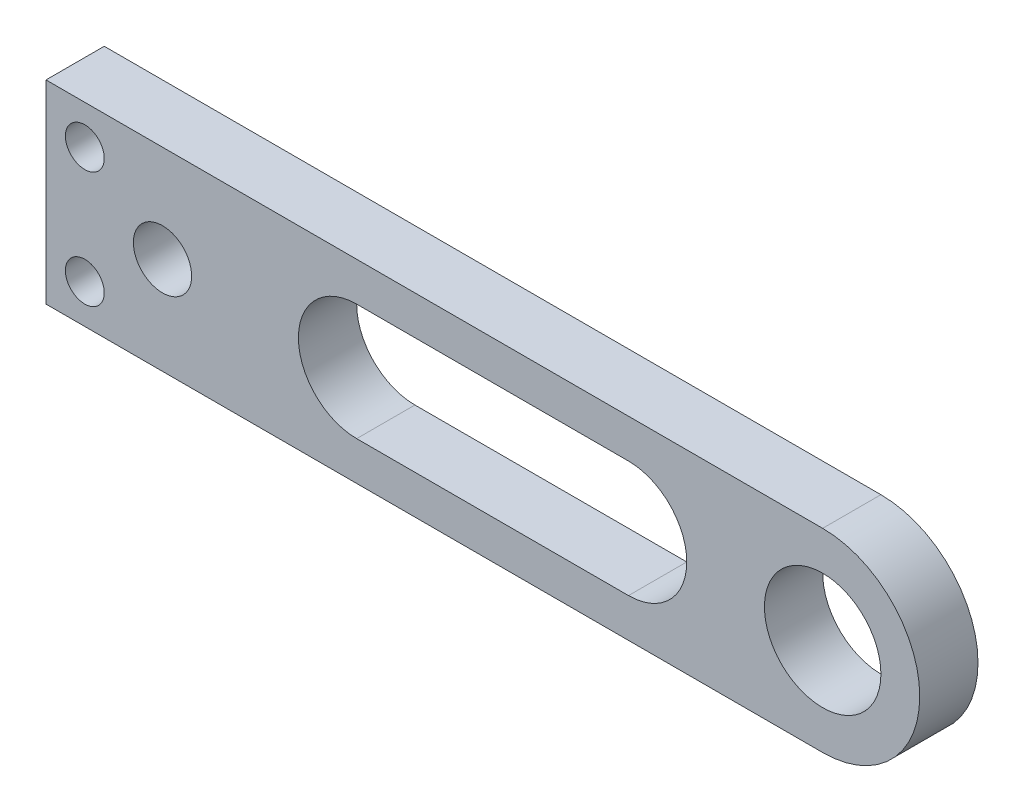
ISO-10303-21;
HEADER;
FILE_DESCRIPTION(('STEP AP214'),'2;1');
FILE_NAME('part.step','',(''),(''),'','','');
FILE_SCHEMA(('AUTOMOTIVE_DESIGN { 1 0 10303 214 1 1 1 1 }'));
ENDSEC;
DATA;
#1=APPLICATION_CONTEXT('core data for automotive mechanical design processes');
#2=APPLICATION_PROTOCOL_DEFINITION('international standard','automotive_design',2000,#1);
#3=PRODUCT_CONTEXT('',#1,'mechanical');
#4=PRODUCT('Part','Part','',(#3));
#5=PRODUCT_RELATED_PRODUCT_CATEGORY('part','',(#4));
#6=PRODUCT_DEFINITION_FORMATION('','',#4);
#7=PRODUCT_DEFINITION_CONTEXT('part definition',#1,'design');
#8=PRODUCT_DEFINITION('design','',#6,#7);
#9=PRODUCT_DEFINITION_SHAPE('','',#8);
#10=(LENGTH_UNIT() NAMED_UNIT(*) SI_UNIT(.MILLI.,.METRE.));
#11=(NAMED_UNIT(*) PLANE_ANGLE_UNIT() SI_UNIT($,.RADIAN.));
#12=(NAMED_UNIT(*) SI_UNIT($,.STERADIAN.) SOLID_ANGLE_UNIT());
#13=UNCERTAINTY_MEASURE_WITH_UNIT(LENGTH_MEASURE(1.E-05),#10,'distance_accuracy_value','');
#14=(GEOMETRIC_REPRESENTATION_CONTEXT(3) GLOBAL_UNCERTAINTY_ASSIGNED_CONTEXT((#13)) GLOBAL_UNIT_ASSIGNED_CONTEXT((#10,
#11,#12)) REPRESENTATION_CONTEXT('',''));
#15=CARTESIAN_POINT('',(0.,0.,0.));
#16=DIRECTION('',(0.,0.,1.));
#17=DIRECTION('',(1.,0.,0.));
#18=AXIS2_PLACEMENT_3D('',#15,#16,#17);
#19=CARTESIAN_POINT('',(34.,0.,3.));
#20=DIRECTION('',(0.,0.,1.));
#21=DIRECTION('',(1.,0.,0.));
#22=AXIS2_PLACEMENT_3D('',#19,#20,#21);
#23=PLANE('',#22);
#24=CARTESIAN_POINT('',(-4.,3.,3.));
#25=DIRECTION('',(0.,0.,1.));
#26=DIRECTION('',(1.,0.,0.));
#27=AXIS2_PLACEMENT_3D('',#24,#25,#26);
#28=CIRCLE('',#27,1.);
#29=CARTESIAN_POINT('',(-3.,3.,3.));
#30=VERTEX_POINT('',#29);
#31=EDGE_CURVE('E128',#30,#30,#28,.T.);
#32=ORIENTED_EDGE('',*,*,#31,.F.);
#33=EDGE_LOOP('',(#32));
#34=FACE_BOUND('',#33,.T.);
#35=CARTESIAN_POINT('',(0.,0.,3.));
#36=DIRECTION('',(0.,0.,1.));
#37=DIRECTION('',(1.,0.,0.));
#38=AXIS2_PLACEMENT_3D('',#35,#36,#37);
#39=CIRCLE('',#38,1.5);
#40=CARTESIAN_POINT('',(1.5,0.,3.));
#41=VERTEX_POINT('',#40);
#42=EDGE_CURVE('E144',#41,#41,#39,.T.);
#43=ORIENTED_EDGE('',*,*,#42,.F.);
#44=EDGE_LOOP('',(#43));
#45=FACE_BOUND('',#44,.T.);
#46=DIRECTION('',(-1.,0.,0.));
#47=VECTOR('',#46,1.);
#48=CARTESIAN_POINT('',(0.,5.,3.));
#49=LINE('',#48,#47);
#50=CARTESIAN_POINT('',(34.,5.,3.));
#51=VERTEX_POINT('',#50);
#52=CARTESIAN_POINT('',(-6.,5.,3.));
#53=VERTEX_POINT('',#52);
#54=EDGE_CURVE('E150',#51,#53,#49,.T.);
#55=ORIENTED_EDGE('',*,*,#54,.T.);
#56=DIRECTION('',(0.,-1.,0.));
#57=VECTOR('',#56,1.);
#58=CARTESIAN_POINT('',(-6.,5.,3.));
#59=LINE('',#58,#57);
#60=CARTESIAN_POINT('',(-6.,-5.,3.));
#61=VERTEX_POINT('',#60);
#62=EDGE_CURVE('E153',#53,#61,#59,.T.);
#63=ORIENTED_EDGE('',*,*,#62,.T.);
#64=DIRECTION('',(1.,0.,0.));
#65=VECTOR('',#64,1.);
#66=CARTESIAN_POINT('',(-6.,-5.,3.));
#67=LINE('',#66,#65);
#68=CARTESIAN_POINT('',(34.,-5.,3.));
#69=VERTEX_POINT('',#68);
#70=EDGE_CURVE('E156',#61,#69,#67,.T.);
#71=ORIENTED_EDGE('',*,*,#70,.T.);
#72=CARTESIAN_POINT('',(34.,0.,3.));
#73=DIRECTION('',(0.,0.,1.));
#74=DIRECTION('',(1.,0.,0.));
#75=AXIS2_PLACEMENT_3D('',#72,#73,#74);
#76=CIRCLE('',#75,5.);
#77=EDGE_CURVE('E158',#69,#51,#76,.T.);
#78=ORIENTED_EDGE('',*,*,#77,.T.);
#79=EDGE_LOOP('',(#55,#63,#71,#78));
#80=FACE_BOUND('',#79,.T.);
#81=CARTESIAN_POINT('',(34.,0.,3.));
#82=DIRECTION('',(0.,0.,1.));
#83=DIRECTION('',(1.,0.,0.));
#84=AXIS2_PLACEMENT_3D('',#81,#82,#83);
#85=CIRCLE('',#84,2.99999999999999);
#86=CARTESIAN_POINT('',(37.,0.,3.));
#87=VERTEX_POINT('',#86);
#88=EDGE_CURVE('E138',#87,#87,#85,.T.);
#89=ORIENTED_EDGE('',*,*,#88,.F.);
#90=EDGE_LOOP('',(#89));
#91=FACE_BOUND('',#90,.T.);
#92=DIRECTION('',(1.,0.,0.));
#93=VECTOR('',#92,1.);
#94=CARTESIAN_POINT('',(10.,-3.,3.));
#95=LINE('',#94,#93);
#96=CARTESIAN_POINT('',(10.,-3.,3.));
#97=VERTEX_POINT('',#96);
#98=CARTESIAN_POINT('',(24.,-3.,3.));
#99=VERTEX_POINT('',#98);
#100=EDGE_CURVE('E107',#97,#99,#95,.T.);
#101=ORIENTED_EDGE('',*,*,#100,.F.);
#102=CARTESIAN_POINT('',(10.,0.,3.));
#103=DIRECTION('',(0.,0.,1.));
#104=DIRECTION('',(1.,0.,0.));
#105=AXIS2_PLACEMENT_3D('',#102,#103,#104);
#106=CIRCLE('',#105,3.);
#107=CARTESIAN_POINT('',(10.,3.,3.));
#108=VERTEX_POINT('',#107);
#109=EDGE_CURVE('E99',#108,#97,#106,.T.);
#110=ORIENTED_EDGE('',*,*,#109,.F.);
#111=DIRECTION('',(-1.,0.,0.));
#112=VECTOR('',#111,1.);
#113=CARTESIAN_POINT('',(10.,3.,3.));
#114=LINE('',#113,#112);
#115=CARTESIAN_POINT('',(24.,3.,3.));
#116=VERTEX_POINT('',#115);
#117=EDGE_CURVE('E122',#116,#108,#114,.T.);
#118=ORIENTED_EDGE('',*,*,#117,.F.);
#119=CARTESIAN_POINT('',(24.,0.,3.));
#120=DIRECTION('',(0.,0.,1.));
#121=DIRECTION('',(1.,0.,0.));
#122=AXIS2_PLACEMENT_3D('',#119,#120,#121);
#123=CIRCLE('',#122,3.);
#124=EDGE_CURVE('E120',#99,#116,#123,.T.);
#125=ORIENTED_EDGE('',*,*,#124,.F.);
#126=EDGE_LOOP('',(#101,#110,#118,#125));
#127=FACE_BOUND('',#126,.T.);
#128=CARTESIAN_POINT('',(-4.,-3.,3.));
#129=DIRECTION('',(0.,0.,1.));
#130=DIRECTION('',(1.,0.,0.));
#131=AXIS2_PLACEMENT_3D('',#128,#129,#130);
#132=CIRCLE('',#131,1.);
#133=CARTESIAN_POINT('',(-3.,-3.,3.));
#134=VERTEX_POINT('',#133);
#135=EDGE_CURVE('E331',#134,#134,#132,.T.);
#136=ORIENTED_EDGE('',*,*,#135,.F.);
#137=EDGE_LOOP('',(#136));
#138=FACE_BOUND('',#137,.T.);
#139=ADVANCED_FACE('F34',(#34,#45,#80,#91,#127,#138),#23,.T.);
#140=CARTESIAN_POINT('',(34.,0.,0.));
#141=DIRECTION('',(0.,0.,1.));
#142=DIRECTION('',(1.,0.,0.));
#143=AXIS2_PLACEMENT_3D('',#140,#141,#142);
#144=PLANE('',#143);
#145=CARTESIAN_POINT('',(34.,0.,0.));
#146=DIRECTION('',(0.,0.,1.));
#147=DIRECTION('',(1.,0.,0.));
#148=AXIS2_PLACEMENT_3D('',#145,#146,#147);
#149=CIRCLE('',#148,2.99999999999999);
#150=CARTESIAN_POINT('',(37.,0.,0.));
#151=VERTEX_POINT('',#150);
#152=EDGE_CURVE('E115',#151,#151,#149,.T.);
#153=ORIENTED_EDGE('',*,*,#152,.T.);
#154=EDGE_LOOP('',(#153));
#155=FACE_BOUND('',#154,.T.);
#156=CARTESIAN_POINT('',(0.,0.,0.));
#157=DIRECTION('',(0.,0.,1.));
#158=DIRECTION('',(1.,0.,0.));
#159=AXIS2_PLACEMENT_3D('',#156,#157,#158);
#160=CIRCLE('',#159,1.5);
#161=CARTESIAN_POINT('',(1.5,0.,0.));
#162=VERTEX_POINT('',#161);
#163=EDGE_CURVE('E141',#162,#162,#160,.T.);
#164=ORIENTED_EDGE('',*,*,#163,.T.);
#165=EDGE_LOOP('',(#164));
#166=FACE_BOUND('',#165,.T.);
#167=DIRECTION('',(0.,-1.,0.));
#168=VECTOR('',#167,1.);
#169=CARTESIAN_POINT('',(-6.,5.,0.));
#170=LINE('',#169,#168);
#171=CARTESIAN_POINT('',(-6.,5.,0.));
#172=VERTEX_POINT('',#171);
#173=CARTESIAN_POINT('',(-6.,-5.,0.));
#174=VERTEX_POINT('',#173);
#175=EDGE_CURVE('E147',#172,#174,#170,.T.);
#176=ORIENTED_EDGE('',*,*,#175,.F.);
#177=DIRECTION('',(-1.,0.,0.));
#178=VECTOR('',#177,1.);
#179=CARTESIAN_POINT('',(0.,5.,0.));
#180=LINE('',#179,#178);
#181=CARTESIAN_POINT('',(34.,5.,0.));
#182=VERTEX_POINT('',#181);
#183=EDGE_CURVE('E154',#182,#172,#180,.T.);
#184=ORIENTED_EDGE('',*,*,#183,.F.);
#185=CARTESIAN_POINT('',(34.,0.,0.));
#186=DIRECTION('',(0.,0.,1.));
#187=DIRECTION('',(1.,0.,0.));
#188=AXIS2_PLACEMENT_3D('',#185,#186,#187);
#189=CIRCLE('',#188,5.);
#190=CARTESIAN_POINT('',(34.,-5.,0.));
#191=VERTEX_POINT('',#190);
#192=EDGE_CURVE('E166',#191,#182,#189,.T.);
#193=ORIENTED_EDGE('',*,*,#192,.F.);
#194=DIRECTION('',(1.,0.,0.));
#195=VECTOR('',#194,1.);
#196=CARTESIAN_POINT('',(0.,-5.,0.));
#197=LINE('',#196,#195);
#198=EDGE_CURVE('E164',#174,#191,#197,.T.);
#199=ORIENTED_EDGE('',*,*,#198,.F.);
#200=EDGE_LOOP('',(#176,#184,#193,#199));
#201=FACE_BOUND('',#200,.T.);
#202=CARTESIAN_POINT('',(10.,0.,0.));
#203=DIRECTION('',(0.,0.,1.));
#204=DIRECTION('',(1.,0.,0.));
#205=AXIS2_PLACEMENT_3D('',#202,#203,#204);
#206=CIRCLE('',#205,3.);
#207=CARTESIAN_POINT('',(10.,3.,0.));
#208=VERTEX_POINT('',#207);
#209=CARTESIAN_POINT('',(10.,-3.,0.));
#210=VERTEX_POINT('',#209);
#211=EDGE_CURVE('E57',#208,#210,#206,.T.);
#212=ORIENTED_EDGE('',*,*,#211,.T.);
#213=DIRECTION('',(1.,0.,0.));
#214=VECTOR('',#213,1.);
#215=CARTESIAN_POINT('',(10.,-3.,0.));
#216=LINE('',#215,#214);
#217=CARTESIAN_POINT('',(24.,-3.,0.));
#218=VERTEX_POINT('',#217);
#219=EDGE_CURVE('E114',#210,#218,#216,.T.);
#220=ORIENTED_EDGE('',*,*,#219,.T.);
#221=CARTESIAN_POINT('',(24.,0.,0.));
#222=DIRECTION('',(0.,0.,1.));
#223=DIRECTION('',(1.,0.,0.));
#224=AXIS2_PLACEMENT_3D('',#221,#222,#223);
#225=CIRCLE('',#224,3.);
#226=CARTESIAN_POINT('',(24.,3.,0.));
#227=VERTEX_POINT('',#226);
#228=EDGE_CURVE('E130',#218,#227,#225,.T.);
#229=ORIENTED_EDGE('',*,*,#228,.T.);
#230=DIRECTION('',(-1.,0.,0.));
#231=VECTOR('',#230,1.);
#232=CARTESIAN_POINT('',(10.,3.,0.));
#233=LINE('',#232,#231);
#234=EDGE_CURVE('E108',#227,#208,#233,.T.);
#235=ORIENTED_EDGE('',*,*,#234,.T.);
#236=EDGE_LOOP('',(#212,#220,#229,#235));
#237=FACE_BOUND('',#236,.T.);
#238=CARTESIAN_POINT('',(-4.,3.,0.));
#239=DIRECTION('',(0.,0.,1.));
#240=DIRECTION('',(1.,0.,0.));
#241=AXIS2_PLACEMENT_3D('',#238,#239,#240);
#242=CIRCLE('',#241,1.);
#243=CARTESIAN_POINT('',(-3.,3.,0.));
#244=VERTEX_POINT('',#243);
#245=EDGE_CURVE('E337',#244,#244,#242,.T.);
#246=ORIENTED_EDGE('',*,*,#245,.T.);
#247=EDGE_LOOP('',(#246));
#248=FACE_BOUND('',#247,.T.);
#249=CARTESIAN_POINT('',(-4.,-3.,0.));
#250=DIRECTION('',(0.,0.,1.));
#251=DIRECTION('',(1.,0.,0.));
#252=AXIS2_PLACEMENT_3D('',#249,#250,#251);
#253=CIRCLE('',#252,1.);
#254=CARTESIAN_POINT('',(-3.,-3.,0.));
#255=VERTEX_POINT('',#254);
#256=EDGE_CURVE('E334',#255,#255,#253,.T.);
#257=ORIENTED_EDGE('',*,*,#256,.T.);
#258=EDGE_LOOP('',(#257));
#259=FACE_BOUND('',#258,.T.);
#260=ADVANCED_FACE('F184',(#155,#166,#201,#237,#248,#259),#144,.F.);
#261=CARTESIAN_POINT('',(-6.,5.,3.));
#262=DIRECTION('',(1.,0.,0.));
#263=DIRECTION('',(0.,1.,0.));
#264=AXIS2_PLACEMENT_3D('',#261,#262,#263);
#265=PLANE('',#264);
#266=ORIENTED_EDGE('',*,*,#175,.T.);
#267=DIRECTION('',(0.,0.,-1.));
#268=VECTOR('',#267,1.);
#269=CARTESIAN_POINT('',(-6.,-5.,3.));
#270=LINE('',#269,#268);
#271=EDGE_CURVE('E42',#61,#174,#270,.T.);
#272=ORIENTED_EDGE('',*,*,#271,.F.);
#273=ORIENTED_EDGE('',*,*,#62,.F.);
#274=DIRECTION('',(0.,0.,-1.));
#275=VECTOR('',#274,1.);
#276=CARTESIAN_POINT('',(-6.,5.,3.));
#277=LINE('',#276,#275);
#278=EDGE_CURVE('E11',#53,#172,#277,.T.);
#279=ORIENTED_EDGE('',*,*,#278,.T.);
#280=EDGE_LOOP('',(#266,#272,#273,#279));
#281=FACE_BOUND('',#280,.T.);
#282=ADVANCED_FACE('F36',(#281),#265,.F.);
#283=CARTESIAN_POINT('',(0.,-5.,3.));
#284=DIRECTION('',(0.,1.,0.));
#285=DIRECTION('',(0.,0.,1.));
#286=AXIS2_PLACEMENT_3D('',#283,#284,#285);
#287=PLANE('',#286);
#288=ORIENTED_EDGE('',*,*,#198,.T.);
#289=DIRECTION('',(0.,0.,-1.));
#290=VECTOR('',#289,1.);
#291=CARTESIAN_POINT('',(34.,-5.,3.));
#292=LINE('',#291,#290);
#293=EDGE_CURVE('E171',#69,#191,#292,.T.);
#294=ORIENTED_EDGE('',*,*,#293,.F.);
#295=ORIENTED_EDGE('',*,*,#70,.F.);
#296=ORIENTED_EDGE('',*,*,#271,.T.);
#297=EDGE_LOOP('',(#288,#294,#295,#296));
#298=FACE_BOUND('',#297,.T.);
#299=ADVANCED_FACE('F177',(#298),#287,.F.);
#300=CARTESIAN_POINT('',(34.,0.,3.));
#301=DIRECTION('',(0.,0.,-1.));
#302=DIRECTION('',(-1.,0.,0.));
#303=AXIS2_PLACEMENT_3D('',#300,#301,#302);
#304=CYLINDRICAL_SURFACE('',#303,5.);
#305=ORIENTED_EDGE('',*,*,#192,.T.);
#306=DIRECTION('',(0.,0.,-1.));
#307=VECTOR('',#306,1.);
#308=CARTESIAN_POINT('',(34.,5.,3.));
#309=LINE('',#308,#307);
#310=EDGE_CURVE('E161',#51,#182,#309,.T.);
#311=ORIENTED_EDGE('',*,*,#310,.F.);
#312=ORIENTED_EDGE('',*,*,#77,.F.);
#313=ORIENTED_EDGE('',*,*,#293,.T.);
#314=EDGE_LOOP('',(#305,#311,#312,#313));
#315=FACE_BOUND('',#314,.T.);
#316=ADVANCED_FACE('F189',(#315),#304,.T.);
#317=CARTESIAN_POINT('',(0.,5.,3.));
#318=DIRECTION('',(0.,-1.,0.));
#319=DIRECTION('',(0.,0.,-1.));
#320=AXIS2_PLACEMENT_3D('',#317,#318,#319);
#321=PLANE('',#320);
#322=ORIENTED_EDGE('',*,*,#183,.T.);
#323=ORIENTED_EDGE('',*,*,#278,.F.);
#324=ORIENTED_EDGE('',*,*,#54,.F.);
#325=ORIENTED_EDGE('',*,*,#310,.T.);
#326=EDGE_LOOP('',(#322,#323,#324,#325));
#327=FACE_BOUND('',#326,.T.);
#328=ADVANCED_FACE('F192',(#327),#321,.F.);
#329=CARTESIAN_POINT('',(0.,0.,3.));
#330=DIRECTION('',(0.,0.,-1.));
#331=DIRECTION('',(-1.,0.,0.));
#332=AXIS2_PLACEMENT_3D('',#329,#330,#331);
#333=CYLINDRICAL_SURFACE('',#332,1.5);
#334=ORIENTED_EDGE('',*,*,#42,.T.);
#335=EDGE_LOOP('',(#334));
#336=FACE_BOUND('',#335,.T.);
#337=ORIENTED_EDGE('',*,*,#163,.F.);
#338=EDGE_LOOP('',(#337));
#339=FACE_BOUND('',#338,.T.);
#340=ADVANCED_FACE('F203',(#336,#339),#333,.F.);
#341=CARTESIAN_POINT('',(34.,0.,3.));
#342=DIRECTION('',(0.,0.,-1.));
#343=DIRECTION('',(-1.,0.,0.));
#344=AXIS2_PLACEMENT_3D('',#341,#342,#343);
#345=CYLINDRICAL_SURFACE('',#344,2.99999999999999);
#346=ORIENTED_EDGE('',*,*,#88,.T.);
#347=EDGE_LOOP('',(#346));
#348=FACE_BOUND('',#347,.T.);
#349=ORIENTED_EDGE('',*,*,#152,.F.);
#350=EDGE_LOOP('',(#349));
#351=FACE_BOUND('',#350,.T.);
#352=ADVANCED_FACE('F200',(#348,#351),#345,.F.);
#353=CARTESIAN_POINT('',(10.,0.,3.));
#354=DIRECTION('',(0.,0.,-1.));
#355=DIRECTION('',(-1.,0.,0.));
#356=AXIS2_PLACEMENT_3D('',#353,#354,#355);
#357=CYLINDRICAL_SURFACE('',#356,3.);
#358=ORIENTED_EDGE('',*,*,#211,.F.);
#359=DIRECTION('',(0.,0.,-1.));
#360=VECTOR('',#359,1.);
#361=CARTESIAN_POINT('',(10.,3.,3.));
#362=LINE('',#361,#360);
#363=EDGE_CURVE('E103',#108,#208,#362,.T.);
#364=ORIENTED_EDGE('',*,*,#363,.F.);
#365=ORIENTED_EDGE('',*,*,#109,.T.);
#366=DIRECTION('',(0.,0.,-1.));
#367=VECTOR('',#366,1.);
#368=CARTESIAN_POINT('',(10.,-3.,3.));
#369=LINE('',#368,#367);
#370=EDGE_CURVE('E102',#97,#210,#369,.T.);
#371=ORIENTED_EDGE('',*,*,#370,.T.);
#372=EDGE_LOOP('',(#358,#364,#365,#371));
#373=FACE_BOUND('',#372,.T.);
#374=ADVANCED_FACE('F101',(#373),#357,.F.);
#375=CARTESIAN_POINT('',(10.,-3.,3.));
#376=DIRECTION('',(0.,1.,0.));
#377=DIRECTION('',(-1.,0.,0.));
#378=AXIS2_PLACEMENT_3D('',#375,#376,#377);
#379=PLANE('',#378);
#380=ORIENTED_EDGE('',*,*,#219,.F.);
#381=ORIENTED_EDGE('',*,*,#370,.F.);
#382=ORIENTED_EDGE('',*,*,#100,.T.);
#383=DIRECTION('',(0.,0.,-1.));
#384=VECTOR('',#383,1.);
#385=CARTESIAN_POINT('',(24.,-3.,3.));
#386=LINE('',#385,#384);
#387=EDGE_CURVE('E116',#99,#218,#386,.T.);
#388=ORIENTED_EDGE('',*,*,#387,.T.);
#389=EDGE_LOOP('',(#380,#381,#382,#388));
#390=FACE_BOUND('',#389,.T.);
#391=ADVANCED_FACE('F111',(#390),#379,.T.);
#392=CARTESIAN_POINT('',(24.,0.,3.));
#393=DIRECTION('',(0.,0.,-1.));
#394=DIRECTION('',(-1.,0.,0.));
#395=AXIS2_PLACEMENT_3D('',#392,#393,#394);
#396=CYLINDRICAL_SURFACE('',#395,3.);
#397=ORIENTED_EDGE('',*,*,#228,.F.);
#398=ORIENTED_EDGE('',*,*,#387,.F.);
#399=ORIENTED_EDGE('',*,*,#124,.T.);
#400=DIRECTION('',(0.,0.,-1.));
#401=VECTOR('',#400,1.);
#402=CARTESIAN_POINT('',(24.,3.,3.));
#403=LINE('',#402,#401);
#404=EDGE_CURVE('E49',#116,#227,#403,.T.);
#405=ORIENTED_EDGE('',*,*,#404,.T.);
#406=EDGE_LOOP('',(#397,#398,#399,#405));
#407=FACE_BOUND('',#406,.T.);
#408=ADVANCED_FACE('F285',(#407),#396,.F.);
#409=CARTESIAN_POINT('',(10.,3.,3.));
#410=DIRECTION('',(0.,-1.,0.));
#411=DIRECTION('',(1.,0.,0.));
#412=AXIS2_PLACEMENT_3D('',#409,#410,#411);
#413=PLANE('',#412);
#414=ORIENTED_EDGE('',*,*,#234,.F.);
#415=ORIENTED_EDGE('',*,*,#404,.F.);
#416=ORIENTED_EDGE('',*,*,#117,.T.);
#417=ORIENTED_EDGE('',*,*,#363,.T.);
#418=EDGE_LOOP('',(#414,#415,#416,#417));
#419=FACE_BOUND('',#418,.T.);
#420=ADVANCED_FACE('F293',(#419),#413,.T.);
#421=CARTESIAN_POINT('',(-4.,3.,3.));
#422=DIRECTION('',(0.,0.,-1.));
#423=DIRECTION('',(-1.,0.,0.));
#424=AXIS2_PLACEMENT_3D('',#421,#422,#423);
#425=CYLINDRICAL_SURFACE('',#424,1.);
#426=ORIENTED_EDGE('',*,*,#31,.T.);
#427=EDGE_LOOP('',(#426));
#428=FACE_BOUND('',#427,.T.);
#429=ORIENTED_EDGE('',*,*,#245,.F.);
#430=EDGE_LOOP('',(#429));
#431=FACE_BOUND('',#430,.T.);
#432=ADVANCED_FACE('F302',(#428,#431),#425,.F.);
#433=CARTESIAN_POINT('',(-4.,-3.,3.));
#434=DIRECTION('',(0.,0.,-1.));
#435=DIRECTION('',(-1.,0.,0.));
#436=AXIS2_PLACEMENT_3D('',#433,#434,#435);
#437=CYLINDRICAL_SURFACE('',#436,1.);
#438=ORIENTED_EDGE('',*,*,#135,.T.);
#439=EDGE_LOOP('',(#438));
#440=FACE_BOUND('',#439,.T.);
#441=ORIENTED_EDGE('',*,*,#256,.F.);
#442=EDGE_LOOP('',(#441));
#443=FACE_BOUND('',#442,.T.);
#444=ADVANCED_FACE('F310',(#440,#443),#437,.F.);
#445=CLOSED_SHELL('',(#139,#260,#282,#299,#316,#328,#340,#352,#374,#391,#408,#420,#432,#444));
#446=MANIFOLD_SOLID_BREP('B2',#445);
#447=ADVANCED_BREP_SHAPE_REPRESENTATION('',(#18,#446),#14);
#448=SHAPE_DEFINITION_REPRESENTATION(#9,#447);
ENDSEC;
END-ISO-10303-21;
